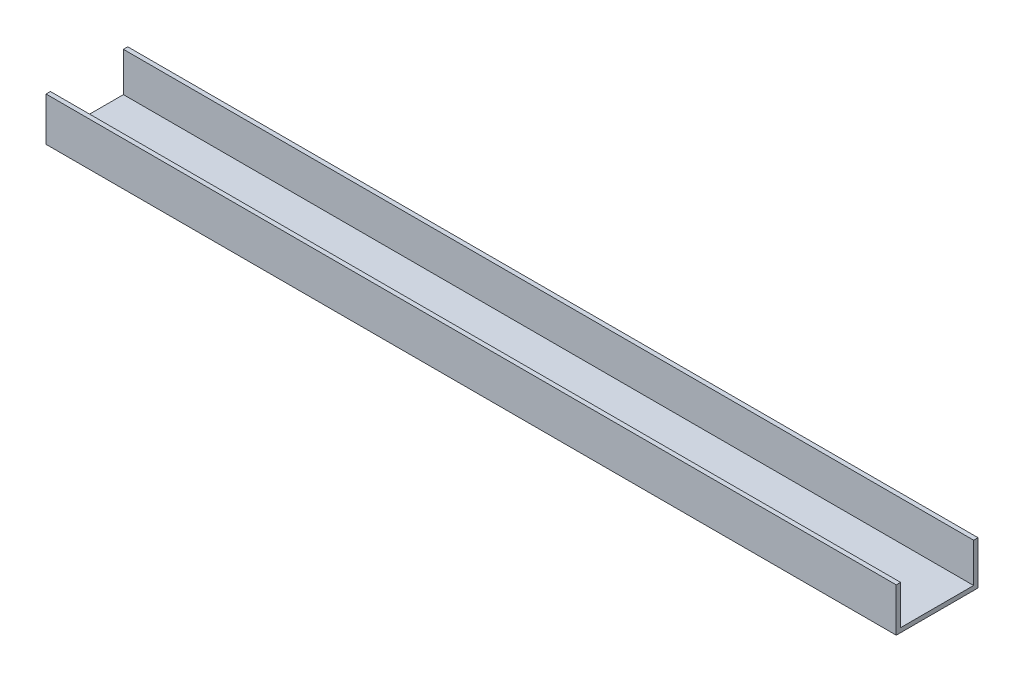
ISO-10303-21;
HEADER;
FILE_DESCRIPTION(('STEP AP214'),'2;1');
FILE_NAME('part.step','',(''),(''),'','','');
FILE_SCHEMA(('AUTOMOTIVE_DESIGN { 1 0 10303 214 1 1 1 1 }'));
ENDSEC;
DATA;
#1=APPLICATION_CONTEXT('core data for automotive mechanical design processes');
#2=APPLICATION_PROTOCOL_DEFINITION('international standard','automotive_design',2000,#1);
#3=PRODUCT_CONTEXT('',#1,'mechanical');
#4=PRODUCT('Part','Part','',(#3));
#5=PRODUCT_RELATED_PRODUCT_CATEGORY('part','',(#4));
#6=PRODUCT_DEFINITION_FORMATION('','',#4);
#7=PRODUCT_DEFINITION_CONTEXT('part definition',#1,'design');
#8=PRODUCT_DEFINITION('design','',#6,#7);
#9=PRODUCT_DEFINITION_SHAPE('','',#8);
#10=(LENGTH_UNIT() NAMED_UNIT(*) SI_UNIT(.MILLI.,.METRE.));
#11=(NAMED_UNIT(*) PLANE_ANGLE_UNIT() SI_UNIT($,.RADIAN.));
#12=(NAMED_UNIT(*) SI_UNIT($,.STERADIAN.) SOLID_ANGLE_UNIT());
#13=UNCERTAINTY_MEASURE_WITH_UNIT(LENGTH_MEASURE(1.E-05),#10,'distance_accuracy_value','');
#14=(GEOMETRIC_REPRESENTATION_CONTEXT(3) GLOBAL_UNCERTAINTY_ASSIGNED_CONTEXT((#13)) GLOBAL_UNIT_ASSIGNED_CONTEXT((#10,
#11,#12)) REPRESENTATION_CONTEXT('',''));
#15=CARTESIAN_POINT('',(0.,0.,0.));
#16=DIRECTION('',(0.,0.,1.));
#17=DIRECTION('',(1.,0.,0.));
#18=AXIS2_PLACEMENT_3D('',#15,#16,#17);
#19=CARTESIAN_POINT('',(0.,4.,0.));
#20=DIRECTION('',(0.,-1.,0.));
#21=DIRECTION('',(0.,0.,-1.));
#22=AXIS2_PLACEMENT_3D('',#19,#20,#21);
#23=PLANE('',#22);
#24=DIRECTION('',(1.,0.,0.));
#25=VECTOR('',#24,1.);
#26=CARTESIAN_POINT('',(780.,4.,-71.));
#27=LINE('',#26,#25);
#28=CARTESIAN_POINT('',(0.,4.,-70.9999999999999));
#29=VERTEX_POINT('',#28);
#30=CARTESIAN_POINT('',(780.,4.,-70.9999999999999));
#31=VERTEX_POINT('',#30);
#32=EDGE_CURVE('E58',#29,#31,#27,.T.);
#33=ORIENTED_EDGE('',*,*,#32,.F.);
#34=DIRECTION('',(0.,0.,1.));
#35=VECTOR('',#34,1.);
#36=CARTESIAN_POINT('',(0.,4.,0.));
#37=LINE('',#36,#35);
#38=CARTESIAN_POINT('',(0.,4.,-4.));
#39=VERTEX_POINT('',#38);
#40=EDGE_CURVE('E154',#29,#39,#37,.T.);
#41=ORIENTED_EDGE('',*,*,#40,.T.);
#42=DIRECTION('',(-1.,0.,0.));
#43=VECTOR('',#42,1.);
#44=CARTESIAN_POINT('',(0.,4.,-4.));
#45=LINE('',#44,#43);
#46=CARTESIAN_POINT('',(780.,4.,-4.));
#47=VERTEX_POINT('',#46);
#48=EDGE_CURVE('E130',#47,#39,#45,.T.);
#49=ORIENTED_EDGE('',*,*,#48,.F.);
#50=DIRECTION('',(0.,0.,-1.));
#51=VECTOR('',#50,1.);
#52=CARTESIAN_POINT('',(780.,4.,0.));
#53=LINE('',#52,#51);
#54=EDGE_CURVE('E63',#47,#31,#53,.T.);
#55=ORIENTED_EDGE('',*,*,#54,.T.);
#56=EDGE_LOOP('',(#33,#41,#49,#55));
#57=FACE_BOUND('',#56,.T.);
#58=ADVANCED_FACE('F43',(#57),#23,.F.);
#59=CARTESIAN_POINT('',(0.,4.,0.));
#60=DIRECTION('',(1.,0.,0.));
#61=DIRECTION('',(0.,0.,-1.));
#62=AXIS2_PLACEMENT_3D('',#59,#60,#61);
#63=PLANE('',#62);
#64=DIRECTION('',(0.,0.,1.));
#65=VECTOR('',#64,1.);
#66=CARTESIAN_POINT('',(0.,0.,0.));
#67=LINE('',#66,#65);
#68=CARTESIAN_POINT('',(0.,0.,-75.));
#69=VERTEX_POINT('',#68);
#70=CARTESIAN_POINT('',(0.,0.,0.));
#71=VERTEX_POINT('',#70);
#72=EDGE_CURVE('E153',#69,#71,#67,.T.);
#73=ORIENTED_EDGE('',*,*,#72,.T.);
#74=DIRECTION('',(0.,-1.,0.));
#75=VECTOR('',#74,1.);
#76=CARTESIAN_POINT('',(0.,4.,0.));
#77=LINE('',#76,#75);
#78=CARTESIAN_POINT('',(0.,40.,0.));
#79=VERTEX_POINT('',#78);
#80=EDGE_CURVE('E11',#79,#71,#77,.T.);
#81=ORIENTED_EDGE('',*,*,#80,.F.);
#82=DIRECTION('',(0.,0.,1.));
#83=VECTOR('',#82,1.);
#84=CARTESIAN_POINT('',(0.,40.,0.));
#85=LINE('',#84,#83);
#86=CARTESIAN_POINT('',(0.,40.,-4.));
#87=VERTEX_POINT('',#86);
#88=EDGE_CURVE('E135',#87,#79,#85,.T.);
#89=ORIENTED_EDGE('',*,*,#88,.F.);
#90=DIRECTION('',(0.,-1.,0.));
#91=VECTOR('',#90,1.);
#92=CARTESIAN_POINT('',(0.,40.,-4.));
#93=LINE('',#92,#91);
#94=EDGE_CURVE('E145',#87,#39,#93,.T.);
#95=ORIENTED_EDGE('',*,*,#94,.T.);
#96=ORIENTED_EDGE('',*,*,#40,.F.);
#97=DIRECTION('',(0.,-1.,0.));
#98=VECTOR('',#97,1.);
#99=CARTESIAN_POINT('',(0.,40.,-70.9999999999999));
#100=LINE('',#99,#98);
#101=CARTESIAN_POINT('',(0.,40.,-70.9999999999999));
#102=VERTEX_POINT('',#101);
#103=EDGE_CURVE('E122',#102,#29,#100,.T.);
#104=ORIENTED_EDGE('',*,*,#103,.F.);
#105=DIRECTION('',(0.,0.,1.));
#106=VECTOR('',#105,1.);
#107=CARTESIAN_POINT('',(0.,40.,-75.));
#108=LINE('',#107,#106);
#109=CARTESIAN_POINT('',(0.,40.,-75.));
#110=VERTEX_POINT('',#109);
#111=EDGE_CURVE('E113',#110,#102,#108,.T.);
#112=ORIENTED_EDGE('',*,*,#111,.F.);
#113=DIRECTION('',(0.,-1.,0.));
#114=VECTOR('',#113,1.);
#115=CARTESIAN_POINT('',(0.,4.,-75.));
#116=LINE('',#115,#114);
#117=EDGE_CURVE('E158',#110,#69,#116,.T.);
#118=ORIENTED_EDGE('',*,*,#117,.T.);
#119=EDGE_LOOP('',(#73,#81,#89,#95,#96,#104,#112,#118));
#120=FACE_BOUND('',#119,.T.);
#121=ADVANCED_FACE('F45',(#120),#63,.F.);
#122=CARTESIAN_POINT('',(0.,4.,0.));
#123=DIRECTION('',(0.,0.,-1.));
#124=DIRECTION('',(-1.,0.,0.));
#125=AXIS2_PLACEMENT_3D('',#122,#123,#124);
#126=PLANE('',#125);
#127=DIRECTION('',(1.,0.,0.));
#128=VECTOR('',#127,1.);
#129=CARTESIAN_POINT('',(0.,0.,0.));
#130=LINE('',#129,#128);
#131=CARTESIAN_POINT('',(780.,0.,0.));
#132=VERTEX_POINT('',#131);
#133=EDGE_CURVE('E161',#71,#132,#130,.T.);
#134=ORIENTED_EDGE('',*,*,#133,.T.);
#135=DIRECTION('',(0.,-1.,0.));
#136=VECTOR('',#135,1.);
#137=CARTESIAN_POINT('',(780.,4.,0.));
#138=LINE('',#137,#136);
#139=CARTESIAN_POINT('',(780.,40.,0.));
#140=VERTEX_POINT('',#139);
#141=EDGE_CURVE('E51',#140,#132,#138,.T.);
#142=ORIENTED_EDGE('',*,*,#141,.F.);
#143=DIRECTION('',(1.,0.,0.));
#144=VECTOR('',#143,1.);
#145=CARTESIAN_POINT('',(0.,40.,0.));
#146=LINE('',#145,#144);
#147=EDGE_CURVE('E138',#79,#140,#146,.T.);
#148=ORIENTED_EDGE('',*,*,#147,.F.);
#149=ORIENTED_EDGE('',*,*,#80,.T.);
#150=EDGE_LOOP('',(#134,#142,#148,#149));
#151=FACE_BOUND('',#150,.T.);
#152=ADVANCED_FACE('F189',(#151),#126,.F.);
#153=CARTESIAN_POINT('',(780.,4.,0.));
#154=DIRECTION('',(-1.,0.,0.));
#155=DIRECTION('',(0.,0.,1.));
#156=AXIS2_PLACEMENT_3D('',#153,#154,#155);
#157=PLANE('',#156);
#158=DIRECTION('',(0.,0.,-1.));
#159=VECTOR('',#158,1.);
#160=CARTESIAN_POINT('',(780.,0.,0.));
#161=LINE('',#160,#159);
#162=CARTESIAN_POINT('',(780.,0.,-75.));
#163=VERTEX_POINT('',#162);
#164=EDGE_CURVE('E163',#132,#163,#161,.T.);
#165=ORIENTED_EDGE('',*,*,#164,.T.);
#166=DIRECTION('',(0.,-1.,0.));
#167=VECTOR('',#166,1.);
#168=CARTESIAN_POINT('',(780.,4.,-75.));
#169=LINE('',#168,#167);
#170=CARTESIAN_POINT('',(780.,40.,-75.));
#171=VERTEX_POINT('',#170);
#172=EDGE_CURVE('E126',#171,#163,#169,.T.);
#173=ORIENTED_EDGE('',*,*,#172,.F.);
#174=DIRECTION('',(0.,0.,-1.));
#175=VECTOR('',#174,1.);
#176=CARTESIAN_POINT('',(780.,40.,-75.));
#177=LINE('',#176,#175);
#178=CARTESIAN_POINT('',(780.,40.,-71.));
#179=VERTEX_POINT('',#178);
#180=EDGE_CURVE('E111',#179,#171,#177,.T.);
#181=ORIENTED_EDGE('',*,*,#180,.F.);
#182=DIRECTION('',(0.,-1.,0.));
#183=VECTOR('',#182,1.);
#184=CARTESIAN_POINT('',(780.,40.,-71.));
#185=LINE('',#184,#183);
#186=EDGE_CURVE('E117',#179,#31,#185,.T.);
#187=ORIENTED_EDGE('',*,*,#186,.T.);
#188=ORIENTED_EDGE('',*,*,#54,.F.);
#189=DIRECTION('',(0.,-1.,0.));
#190=VECTOR('',#189,1.);
#191=CARTESIAN_POINT('',(780.,40.,-4.));
#192=LINE('',#191,#190);
#193=CARTESIAN_POINT('',(780.,40.,-4.));
#194=VERTEX_POINT('',#193);
#195=EDGE_CURVE('E150',#194,#47,#192,.T.);
#196=ORIENTED_EDGE('',*,*,#195,.F.);
#197=DIRECTION('',(0.,0.,-1.));
#198=VECTOR('',#197,1.);
#199=CARTESIAN_POINT('',(780.,40.,0.));
#200=LINE('',#199,#198);
#201=EDGE_CURVE('E141',#140,#194,#200,.T.);
#202=ORIENTED_EDGE('',*,*,#201,.F.);
#203=ORIENTED_EDGE('',*,*,#141,.T.);
#204=EDGE_LOOP('',(#165,#173,#181,#187,#188,#196,#202,#203));
#205=FACE_BOUND('',#204,.T.);
#206=ADVANCED_FACE('F124',(#205),#157,.F.);
#207=CARTESIAN_POINT('',(0.,4.,-75.));
#208=DIRECTION('',(0.,0.,1.));
#209=DIRECTION('',(1.,0.,0.));
#210=AXIS2_PLACEMENT_3D('',#207,#208,#209);
#211=PLANE('',#210);
#212=DIRECTION('',(-1.,0.,0.));
#213=VECTOR('',#212,1.);
#214=CARTESIAN_POINT('',(0.,0.,-75.));
#215=LINE('',#214,#213);
#216=EDGE_CURVE('E156',#163,#69,#215,.T.);
#217=ORIENTED_EDGE('',*,*,#216,.T.);
#218=ORIENTED_EDGE('',*,*,#117,.F.);
#219=DIRECTION('',(-1.,0.,0.));
#220=VECTOR('',#219,1.);
#221=CARTESIAN_POINT('',(780.,40.,-75.));
#222=LINE('',#221,#220);
#223=EDGE_CURVE('E128',#171,#110,#222,.T.);
#224=ORIENTED_EDGE('',*,*,#223,.F.);
#225=ORIENTED_EDGE('',*,*,#172,.T.);
#226=EDGE_LOOP('',(#217,#218,#224,#225));
#227=FACE_BOUND('',#226,.T.);
#228=ADVANCED_FACE('F179',(#227),#211,.F.);
#229=CARTESIAN_POINT('',(0.,0.,0.));
#230=DIRECTION('',(0.,-1.,0.));
#231=DIRECTION('',(0.,0.,-1.));
#232=AXIS2_PLACEMENT_3D('',#229,#230,#231);
#233=PLANE('',#232);
#234=ORIENTED_EDGE('',*,*,#72,.F.);
#235=ORIENTED_EDGE('',*,*,#216,.F.);
#236=ORIENTED_EDGE('',*,*,#164,.F.);
#237=ORIENTED_EDGE('',*,*,#133,.F.);
#238=EDGE_LOOP('',(#234,#235,#236,#237));
#239=FACE_BOUND('',#238,.T.);
#240=ADVANCED_FACE('F177',(#239),#233,.T.);
#241=CARTESIAN_POINT('',(0.,40.,-4.));
#242=DIRECTION('',(0.,0.,1.));
#243=DIRECTION('',(1.,0.,0.));
#244=AXIS2_PLACEMENT_3D('',#241,#242,#243);
#245=PLANE('',#244);
#246=ORIENTED_EDGE('',*,*,#48,.T.);
#247=ORIENTED_EDGE('',*,*,#94,.F.);
#248=DIRECTION('',(-1.,0.,0.));
#249=VECTOR('',#248,1.);
#250=CARTESIAN_POINT('',(0.,40.,-4.));
#251=LINE('',#250,#249);
#252=EDGE_CURVE('E143',#194,#87,#251,.T.);
#253=ORIENTED_EDGE('',*,*,#252,.F.);
#254=ORIENTED_EDGE('',*,*,#195,.T.);
#255=EDGE_LOOP('',(#246,#247,#253,#254));
#256=FACE_BOUND('',#255,.T.);
#257=ADVANCED_FACE('F185',(#256),#245,.F.);
#258=CARTESIAN_POINT('',(0.,40.,0.));
#259=DIRECTION('',(0.,-1.,0.));
#260=DIRECTION('',(0.,0.,-1.));
#261=AXIS2_PLACEMENT_3D('',#258,#259,#260);
#262=PLANE('',#261);
#263=ORIENTED_EDGE('',*,*,#88,.T.);
#264=ORIENTED_EDGE('',*,*,#147,.T.);
#265=ORIENTED_EDGE('',*,*,#201,.T.);
#266=ORIENTED_EDGE('',*,*,#252,.T.);
#267=EDGE_LOOP('',(#263,#264,#265,#266));
#268=FACE_BOUND('',#267,.T.);
#269=ADVANCED_FACE('F188',(#268),#262,.F.);
#270=CARTESIAN_POINT('',(780.,40.,-71.));
#271=DIRECTION('',(0.,0.,-1.));
#272=DIRECTION('',(-1.,0.,0.));
#273=AXIS2_PLACEMENT_3D('',#270,#271,#272);
#274=PLANE('',#273);
#275=ORIENTED_EDGE('',*,*,#32,.T.);
#276=ORIENTED_EDGE('',*,*,#186,.F.);
#277=DIRECTION('',(1.,0.,0.));
#278=VECTOR('',#277,1.);
#279=CARTESIAN_POINT('',(780.,40.,-71.));
#280=LINE('',#279,#278);
#281=EDGE_CURVE('E106',#102,#179,#280,.T.);
#282=ORIENTED_EDGE('',*,*,#281,.F.);
#283=ORIENTED_EDGE('',*,*,#103,.T.);
#284=EDGE_LOOP('',(#275,#276,#282,#283));
#285=FACE_BOUND('',#284,.T.);
#286=ADVANCED_FACE('F120',(#285),#274,.F.);
#287=CARTESIAN_POINT('',(0.,40.,0.));
#288=DIRECTION('',(0.,-1.,0.));
#289=DIRECTION('',(0.,0.,-1.));
#290=AXIS2_PLACEMENT_3D('',#287,#288,#289);
#291=PLANE('',#290);
#292=ORIENTED_EDGE('',*,*,#180,.T.);
#293=ORIENTED_EDGE('',*,*,#223,.T.);
#294=ORIENTED_EDGE('',*,*,#111,.T.);
#295=ORIENTED_EDGE('',*,*,#281,.T.);
#296=EDGE_LOOP('',(#292,#293,#294,#295));
#297=FACE_BOUND('',#296,.T.);
#298=ADVANCED_FACE('F108',(#297),#291,.F.);
#299=CLOSED_SHELL('',(#58,#121,#152,#206,#228,#240,#257,#269,#286,#298));
#300=MANIFOLD_SOLID_BREP('B2',#299);
#301=ADVANCED_BREP_SHAPE_REPRESENTATION('',(#18,#300),#14);
#302=SHAPE_DEFINITION_REPRESENTATION(#9,#301);
ENDSEC;
END-ISO-10303-21;
